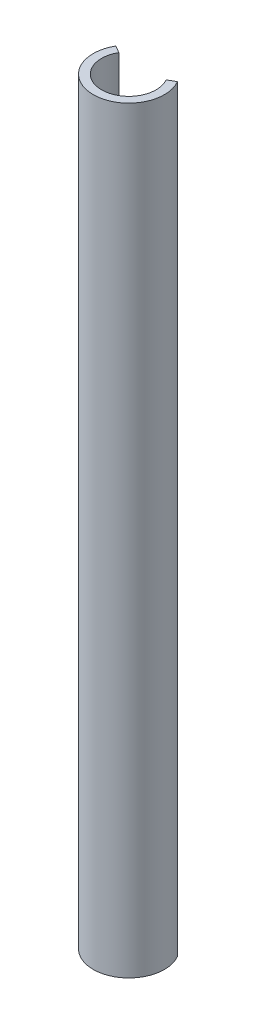
ISO-10303-21;
HEADER;
FILE_DESCRIPTION(('STEP AP214'),'2;1');
FILE_NAME('part.step','',(''),(''),'','','');
FILE_SCHEMA(('AUTOMOTIVE_DESIGN { 1 0 10303 214 1 1 1 1 }'));
ENDSEC;
DATA;
#1=APPLICATION_CONTEXT('core data for automotive mechanical design processes');
#2=APPLICATION_PROTOCOL_DEFINITION('international standard','automotive_design',2000,#1);
#3=PRODUCT_CONTEXT('',#1,'mechanical');
#4=PRODUCT('Part','Part','',(#3));
#5=PRODUCT_RELATED_PRODUCT_CATEGORY('part','',(#4));
#6=PRODUCT_DEFINITION_FORMATION('','',#4);
#7=PRODUCT_DEFINITION_CONTEXT('part definition',#1,'design');
#8=PRODUCT_DEFINITION('design','',#6,#7);
#9=PRODUCT_DEFINITION_SHAPE('','',#8);
#10=(LENGTH_UNIT() NAMED_UNIT(*) SI_UNIT(.MILLI.,.METRE.));
#11=(NAMED_UNIT(*) PLANE_ANGLE_UNIT() SI_UNIT($,.RADIAN.));
#12=(NAMED_UNIT(*) SI_UNIT($,.STERADIAN.) SOLID_ANGLE_UNIT());
#13=UNCERTAINTY_MEASURE_WITH_UNIT(LENGTH_MEASURE(1.E-05),#10,'distance_accuracy_value','');
#14=(GEOMETRIC_REPRESENTATION_CONTEXT(3) GLOBAL_UNCERTAINTY_ASSIGNED_CONTEXT((#13)) GLOBAL_UNIT_ASSIGNED_CONTEXT((#10,
#11,#12)) REPRESENTATION_CONTEXT('',''));
#15=CARTESIAN_POINT('',(0.,0.,0.));
#16=DIRECTION('',(0.,0.,1.));
#17=DIRECTION('',(1.,0.,0.));
#18=AXIS2_PLACEMENT_3D('',#15,#16,#17);
#19=CARTESIAN_POINT('',(0.,500.,0.));
#20=DIRECTION('',(0.,-1.,0.));
#21=DIRECTION('',(0.,0.,-1.));
#22=AXIS2_PLACEMENT_3D('',#19,#20,#21);
#23=CYLINDRICAL_SURFACE('',#22,18.);
#24=CARTESIAN_POINT('',(0.,0.,0.));
#25=DIRECTION('',(0.,-1.,0.));
#26=DIRECTION('',(0.,0.,1.));
#27=AXIS2_PLACEMENT_3D('',#24,#25,#26);
#28=CIRCLE('',#27,18.);
#29=CARTESIAN_POINT('',(15.5884572681199,0.,-8.99999999999996));
#30=VERTEX_POINT('',#29);
#31=CARTESIAN_POINT('',(-15.5884572681199,0.,-8.99999999999996));
#32=VERTEX_POINT('',#31);
#33=EDGE_CURVE('E98',#30,#32,#28,.T.);
#34=ORIENTED_EDGE('',*,*,#33,.T.);
#35=DIRECTION('',(0.,-1.,0.));
#36=VECTOR('',#35,1.);
#37=CARTESIAN_POINT('',(-15.5884572681199,500.,-8.99999999999996));
#38=LINE('',#37,#36);
#39=CARTESIAN_POINT('',(-15.5884572681199,500.,-8.99999999999996));
#40=VERTEX_POINT('',#39);
#41=EDGE_CURVE('E11',#40,#32,#38,.T.);
#42=ORIENTED_EDGE('',*,*,#41,.F.);
#43=CARTESIAN_POINT('',(0.,500.,0.));
#44=DIRECTION('',(0.,-1.,0.));
#45=DIRECTION('',(0.,0.,1.));
#46=AXIS2_PLACEMENT_3D('',#43,#44,#45);
#47=CIRCLE('',#46,18.);
#48=CARTESIAN_POINT('',(15.5884572681199,500.,-8.99999999999996));
#49=VERTEX_POINT('',#48);
#50=EDGE_CURVE('E86',#49,#40,#47,.T.);
#51=ORIENTED_EDGE('',*,*,#50,.F.);
#52=DIRECTION('',(0.,-1.,0.));
#53=VECTOR('',#52,1.);
#54=CARTESIAN_POINT('',(15.5884572681199,500.,-8.99999999999996));
#55=LINE('',#54,#53);
#56=EDGE_CURVE('E94',#49,#30,#55,.T.);
#57=ORIENTED_EDGE('',*,*,#56,.T.);
#58=EDGE_LOOP('',(#34,#42,#51,#57));
#59=FACE_BOUND('',#58,.T.);
#60=ADVANCED_FACE('F35',(#59),#23,.F.);
#61=CARTESIAN_POINT('',(-15.5884572681199,500.,-8.99999999999996));
#62=DIRECTION('',(-0.499999999999998,0.,0.86602540378444));
#63=DIRECTION('',(0.86602540378444,0.,0.499999999999998));
#64=AXIS2_PLACEMENT_3D('',#61,#62,#63);
#65=PLANE('',#64);
#66=DIRECTION('',(-0.86602540378444,0.,-0.499999999999998));
#67=VECTOR('',#66,1.);
#68=CARTESIAN_POINT('',(-15.5884572681199,0.,-8.99999999999996));
#69=LINE('',#68,#67);
#70=CARTESIAN_POINT('',(-20.3515969889343,0.,-11.75));
#71=VERTEX_POINT('',#70);
#72=EDGE_CURVE('E90',#32,#71,#69,.T.);
#73=ORIENTED_EDGE('',*,*,#72,.T.);
#74=DIRECTION('',(0.,-1.,0.));
#75=VECTOR('',#74,1.);
#76=CARTESIAN_POINT('',(-20.3515969889343,500.,-11.75));
#77=LINE('',#76,#75);
#78=CARTESIAN_POINT('',(-20.3515969889343,500.,-11.75));
#79=VERTEX_POINT('',#78);
#80=EDGE_CURVE('E43',#79,#71,#77,.T.);
#81=ORIENTED_EDGE('',*,*,#80,.F.);
#82=DIRECTION('',(-0.86602540378444,0.,-0.499999999999998));
#83=VECTOR('',#82,1.);
#84=CARTESIAN_POINT('',(-15.5884572681199,500.,-8.99999999999996));
#85=LINE('',#84,#83);
#86=EDGE_CURVE('E81',#40,#79,#85,.T.);
#87=ORIENTED_EDGE('',*,*,#86,.F.);
#88=ORIENTED_EDGE('',*,*,#41,.T.);
#89=EDGE_LOOP('',(#73,#81,#87,#88));
#90=FACE_BOUND('',#89,.T.);
#91=ADVANCED_FACE('F89',(#90),#65,.F.);
#92=CARTESIAN_POINT('',(0.,500.,0.));
#93=DIRECTION('',(0.,-1.,0.));
#94=DIRECTION('',(0.,0.,-1.));
#95=AXIS2_PLACEMENT_3D('',#92,#93,#94);
#96=CYLINDRICAL_SURFACE('',#95,23.5);
#97=CARTESIAN_POINT('',(0.,0.,0.));
#98=DIRECTION('',(0.,1.,0.));
#99=DIRECTION('',(0.,0.,1.));
#100=AXIS2_PLACEMENT_3D('',#97,#98,#99);
#101=CIRCLE('',#100,23.5);
#102=CARTESIAN_POINT('',(20.3515969889343,0.,-11.75));
#103=VERTEX_POINT('',#102);
#104=EDGE_CURVE('E68',#71,#103,#101,.T.);
#105=ORIENTED_EDGE('',*,*,#104,.T.);
#106=DIRECTION('',(0.,-1.,0.));
#107=VECTOR('',#106,1.);
#108=CARTESIAN_POINT('',(20.3515969889343,500.,-11.75));
#109=LINE('',#108,#107);
#110=CARTESIAN_POINT('',(20.3515969889343,500.,-11.75));
#111=VERTEX_POINT('',#110);
#112=EDGE_CURVE('E91',#111,#103,#109,.T.);
#113=ORIENTED_EDGE('',*,*,#112,.F.);
#114=CARTESIAN_POINT('',(0.,500.,0.));
#115=DIRECTION('',(0.,1.,0.));
#116=DIRECTION('',(0.,0.,1.));
#117=AXIS2_PLACEMENT_3D('',#114,#115,#116);
#118=CIRCLE('',#117,23.5);
#119=EDGE_CURVE('E84',#79,#111,#118,.T.);
#120=ORIENTED_EDGE('',*,*,#119,.F.);
#121=ORIENTED_EDGE('',*,*,#80,.T.);
#122=EDGE_LOOP('',(#105,#113,#120,#121));
#123=FACE_BOUND('',#122,.T.);
#124=ADVANCED_FACE('F92',(#123),#96,.T.);
#125=CARTESIAN_POINT('',(15.5884572681199,500.,-8.99999999999996));
#126=DIRECTION('',(0.499999999999998,0.,0.86602540378444));
#127=DIRECTION('',(0.86602540378444,0.,-0.499999999999998));
#128=AXIS2_PLACEMENT_3D('',#125,#126,#127);
#129=PLANE('',#128);
#130=DIRECTION('',(-0.86602540378444,0.,0.499999999999998));
#131=VECTOR('',#130,1.);
#132=CARTESIAN_POINT('',(15.5884572681199,0.,-8.99999999999996));
#133=LINE('',#132,#131);
#134=EDGE_CURVE('E74',#103,#30,#133,.T.);
#135=ORIENTED_EDGE('',*,*,#134,.T.);
#136=ORIENTED_EDGE('',*,*,#56,.F.);
#137=DIRECTION('',(-0.86602540378444,0.,0.499999999999998));
#138=VECTOR('',#137,1.);
#139=CARTESIAN_POINT('',(15.5884572681199,500.,-8.99999999999996));
#140=LINE('',#139,#138);
#141=EDGE_CURVE('E51',#111,#49,#140,.T.);
#142=ORIENTED_EDGE('',*,*,#141,.F.);
#143=ORIENTED_EDGE('',*,*,#112,.T.);
#144=EDGE_LOOP('',(#135,#136,#142,#143));
#145=FACE_BOUND('',#144,.T.);
#146=ADVANCED_FACE('F105',(#145),#129,.F.);
#147=CARTESIAN_POINT('',(0.,500.,0.));
#148=DIRECTION('',(0.,1.,0.));
#149=DIRECTION('',(0.,0.,1.));
#150=AXIS2_PLACEMENT_3D('',#147,#148,#149);
#151=PLANE('',#150);
#152=ORIENTED_EDGE('',*,*,#50,.T.);
#153=ORIENTED_EDGE('',*,*,#86,.T.);
#154=ORIENTED_EDGE('',*,*,#119,.T.);
#155=ORIENTED_EDGE('',*,*,#141,.T.);
#156=EDGE_LOOP('',(#152,#153,#154,#155));
#157=FACE_BOUND('',#156,.T.);
#158=ADVANCED_FACE('F82',(#157),#151,.T.);
#159=CARTESIAN_POINT('',(0.,0.,0.));
#160=DIRECTION('',(0.,1.,0.));
#161=DIRECTION('',(0.,0.,1.));
#162=AXIS2_PLACEMENT_3D('',#159,#160,#161);
#163=PLANE('',#162);
#164=ORIENTED_EDGE('',*,*,#33,.F.);
#165=ORIENTED_EDGE('',*,*,#134,.F.);
#166=ORIENTED_EDGE('',*,*,#104,.F.);
#167=ORIENTED_EDGE('',*,*,#72,.F.);
#168=EDGE_LOOP('',(#164,#165,#166,#167));
#169=FACE_BOUND('',#168,.T.);
#170=ADVANCED_FACE('F108',(#169),#163,.F.);
#171=CLOSED_SHELL('',(#60,#91,#124,#146,#158,#170));
#172=MANIFOLD_SOLID_BREP('B2',#171);
#173=ADVANCED_BREP_SHAPE_REPRESENTATION('',(#18,#172),#14);
#174=SHAPE_DEFINITION_REPRESENTATION(#9,#173);
ENDSEC;
END-ISO-10303-21;
